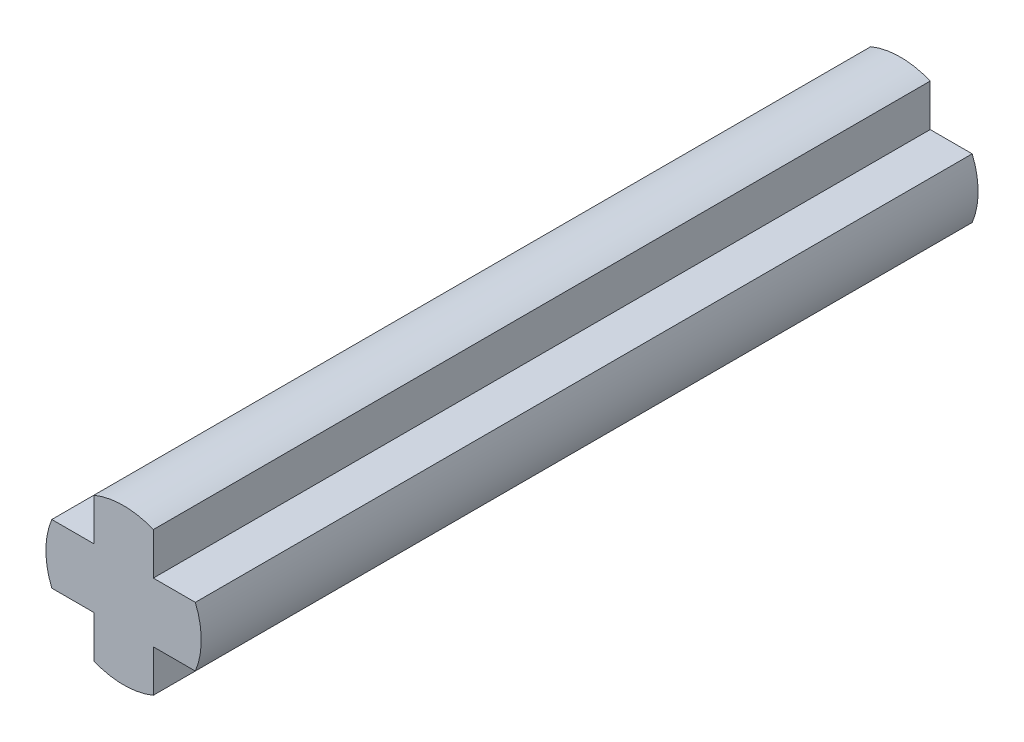
ISO-10303-21;
HEADER;
FILE_DESCRIPTION(('STEP AP214'),'2;1');
FILE_NAME('part.step','',(''),(''),'','','');
FILE_SCHEMA(('AUTOMOTIVE_DESIGN { 1 0 10303 214 1 1 1 1 }'));
ENDSEC;
DATA;
#1=APPLICATION_CONTEXT('core data for automotive mechanical design processes');
#2=APPLICATION_PROTOCOL_DEFINITION('international standard','automotive_design',2000,#1);
#3=PRODUCT_CONTEXT('',#1,'mechanical');
#4=PRODUCT('Part','Part','',(#3));
#5=PRODUCT_RELATED_PRODUCT_CATEGORY('part','',(#4));
#6=PRODUCT_DEFINITION_FORMATION('','',#4);
#7=PRODUCT_DEFINITION_CONTEXT('part definition',#1,'design');
#8=PRODUCT_DEFINITION('design','',#6,#7);
#9=PRODUCT_DEFINITION_SHAPE('','',#8);
#10=(LENGTH_UNIT() NAMED_UNIT(*) SI_UNIT(.MILLI.,.METRE.));
#11=(NAMED_UNIT(*) PLANE_ANGLE_UNIT() SI_UNIT($,.RADIAN.));
#12=(NAMED_UNIT(*) SI_UNIT($,.STERADIAN.) SOLID_ANGLE_UNIT());
#13=UNCERTAINTY_MEASURE_WITH_UNIT(LENGTH_MEASURE(1.E-05),#10,'distance_accuracy_value','');
#14=(GEOMETRIC_REPRESENTATION_CONTEXT(3) GLOBAL_UNCERTAINTY_ASSIGNED_CONTEXT((#13)) GLOBAL_UNIT_ASSIGNED_CONTEXT((#10,
#11,#12)) REPRESENTATION_CONTEXT('',''));
#15=CARTESIAN_POINT('',(0.,0.,0.));
#16=DIRECTION('',(0.,0.,1.));
#17=DIRECTION('',(1.,0.,0.));
#18=AXIS2_PLACEMENT_3D('',#15,#16,#17);
#19=CARTESIAN_POINT('',(-2.17082933460924,0.9,11.75));
#20=DIRECTION('',(0.,-1.,0.));
#21=DIRECTION('',(0.,0.,-1.));
#22=AXIS2_PLACEMENT_3D('',#19,#20,#21);
#23=PLANE('',#22);
#24=DIRECTION('',(-1.,0.,0.));
#25=VECTOR('',#24,1.);
#26=CARTESIAN_POINT('',(-2.17082933460924,0.9,-11.75));
#27=LINE('',#26,#25);
#28=CARTESIAN_POINT('',(-0.9,0.9,-11.75));
#29=VERTEX_POINT('',#28);
#30=CARTESIAN_POINT('',(-2.17082933460924,0.9,-11.75));
#31=VERTEX_POINT('',#30);
#32=EDGE_CURVE('E157',#29,#31,#27,.T.);
#33=ORIENTED_EDGE('',*,*,#32,.T.);
#34=DIRECTION('',(0.,0.,-1.));
#35=VECTOR('',#34,1.);
#36=CARTESIAN_POINT('',(-2.17082933460924,0.9,11.75));
#37=LINE('',#36,#35);
#38=CARTESIAN_POINT('',(-2.17082933460924,0.9,11.75));
#39=VERTEX_POINT('',#38);
#40=EDGE_CURVE('E11',#39,#31,#37,.T.);
#41=ORIENTED_EDGE('',*,*,#40,.F.);
#42=DIRECTION('',(-1.,0.,0.));
#43=VECTOR('',#42,1.);
#44=CARTESIAN_POINT('',(-2.17082933460924,0.9,11.75));
#45=LINE('',#44,#43);
#46=CARTESIAN_POINT('',(-0.9,0.9,11.75));
#47=VERTEX_POINT('',#46);
#48=EDGE_CURVE('E179',#47,#39,#45,.T.);
#49=ORIENTED_EDGE('',*,*,#48,.F.);
#50=DIRECTION('',(0.,0.,-1.));
#51=VECTOR('',#50,1.);
#52=CARTESIAN_POINT('',(-0.9,0.9,11.75));
#53=LINE('',#52,#51);
#54=EDGE_CURVE('E153',#47,#29,#53,.T.);
#55=ORIENTED_EDGE('',*,*,#54,.T.);
#56=EDGE_LOOP('',(#33,#41,#49,#55));
#57=FACE_BOUND('',#56,.T.);
#58=ADVANCED_FACE('F37',(#57),#23,.F.);
#59=CARTESIAN_POINT('',(0.,0.,11.75));
#60=DIRECTION('',(0.,0.,-1.));
#61=DIRECTION('',(-1.,0.,0.));
#62=AXIS2_PLACEMENT_3D('',#59,#60,#61);
#63=CYLINDRICAL_SURFACE('',#62,2.35);
#64=CARTESIAN_POINT('',(0.,0.,-11.75));
#65=DIRECTION('',(0.,0.,1.));
#66=DIRECTION('',(1.,0.,0.));
#67=AXIS2_PLACEMENT_3D('',#64,#65,#66);
#68=CIRCLE('',#67,2.35);
#69=CARTESIAN_POINT('',(-2.17082933460924,-0.9,-11.75));
#70=VERTEX_POINT('',#69);
#71=EDGE_CURVE('E160',#31,#70,#68,.T.);
#72=ORIENTED_EDGE('',*,*,#71,.T.);
#73=DIRECTION('',(0.,0.,-1.));
#74=VECTOR('',#73,1.);
#75=CARTESIAN_POINT('',(-2.17082933460924,-0.9,11.75));
#76=LINE('',#75,#74);
#77=CARTESIAN_POINT('',(-2.17082933460924,-0.9,11.75));
#78=VERTEX_POINT('',#77);
#79=EDGE_CURVE('E45',#78,#70,#76,.T.);
#80=ORIENTED_EDGE('',*,*,#79,.F.);
#81=CARTESIAN_POINT('',(0.,0.,11.75));
#82=DIRECTION('',(0.,0.,1.));
#83=DIRECTION('',(1.,0.,0.));
#84=AXIS2_PLACEMENT_3D('',#81,#82,#83);
#85=CIRCLE('',#84,2.35);
#86=EDGE_CURVE('E108',#39,#78,#85,.T.);
#87=ORIENTED_EDGE('',*,*,#86,.F.);
#88=ORIENTED_EDGE('',*,*,#40,.T.);
#89=EDGE_LOOP('',(#72,#80,#87,#88));
#90=FACE_BOUND('',#89,.T.);
#91=ADVANCED_FACE('F257',(#90),#63,.T.);
#92=CARTESIAN_POINT('',(-2.17082933460924,-0.9,11.75));
#93=DIRECTION('',(0.,1.,0.));
#94=DIRECTION('',(-1.,0.,0.));
#95=AXIS2_PLACEMENT_3D('',#92,#93,#94);
#96=PLANE('',#95);
#97=DIRECTION('',(1.,0.,0.));
#98=VECTOR('',#97,1.);
#99=CARTESIAN_POINT('',(-2.17082933460924,-0.9,-11.75));
#100=LINE('',#99,#98);
#101=CARTESIAN_POINT('',(-0.9,-0.9,-11.75));
#102=VERTEX_POINT('',#101);
#103=EDGE_CURVE('E162',#70,#102,#100,.T.);
#104=ORIENTED_EDGE('',*,*,#103,.T.);
#105=DIRECTION('',(0.,0.,-1.));
#106=VECTOR('',#105,1.);
#107=CARTESIAN_POINT('',(-0.9,-0.9,11.75));
#108=LINE('',#107,#106);
#109=CARTESIAN_POINT('',(-0.9,-0.9,11.75));
#110=VERTEX_POINT('',#109);
#111=EDGE_CURVE('E198',#110,#102,#108,.T.);
#112=ORIENTED_EDGE('',*,*,#111,.F.);
#113=DIRECTION('',(1.,0.,0.));
#114=VECTOR('',#113,1.);
#115=CARTESIAN_POINT('',(-2.17082933460924,-0.9,11.75));
#116=LINE('',#115,#114);
#117=EDGE_CURVE('E206',#78,#110,#116,.T.);
#118=ORIENTED_EDGE('',*,*,#117,.F.);
#119=ORIENTED_EDGE('',*,*,#79,.T.);
#120=EDGE_LOOP('',(#104,#112,#118,#119));
#121=FACE_BOUND('',#120,.T.);
#122=ADVANCED_FACE('F204',(#121),#96,.F.);
#123=CARTESIAN_POINT('',(-0.9,-0.9,11.75));
#124=DIRECTION('',(1.,0.,0.));
#125=DIRECTION('',(0.,1.,0.));
#126=AXIS2_PLACEMENT_3D('',#123,#124,#125);
#127=PLANE('',#126);
#128=DIRECTION('',(0.,-1.,0.));
#129=VECTOR('',#128,1.);
#130=CARTESIAN_POINT('',(-0.9,-0.9,-11.75));
#131=LINE('',#130,#129);
#132=CARTESIAN_POINT('',(-0.900000000000001,-2.17082933460924,-11.75));
#133=VERTEX_POINT('',#132);
#134=EDGE_CURVE('E164',#102,#133,#131,.T.);
#135=ORIENTED_EDGE('',*,*,#134,.T.);
#136=DIRECTION('',(0.,0.,-1.));
#137=VECTOR('',#136,1.);
#138=CARTESIAN_POINT('',(-0.900000000000001,-2.17082933460924,11.75));
#139=LINE('',#138,#137);
#140=CARTESIAN_POINT('',(-0.900000000000001,-2.17082933460924,11.75));
#141=VERTEX_POINT('',#140);
#142=EDGE_CURVE('E195',#141,#133,#139,.T.);
#143=ORIENTED_EDGE('',*,*,#142,.F.);
#144=DIRECTION('',(0.,-1.,0.));
#145=VECTOR('',#144,1.);
#146=CARTESIAN_POINT('',(-0.9,-0.9,11.75));
#147=LINE('',#146,#145);
#148=EDGE_CURVE('E224',#110,#141,#147,.T.);
#149=ORIENTED_EDGE('',*,*,#148,.F.);
#150=ORIENTED_EDGE('',*,*,#111,.T.);
#151=EDGE_LOOP('',(#135,#143,#149,#150));
#152=FACE_BOUND('',#151,.T.);
#153=ADVANCED_FACE('F215',(#152),#127,.F.);
#154=CARTESIAN_POINT('',(0.,0.,11.75));
#155=DIRECTION('',(0.,0.,-1.));
#156=DIRECTION('',(-1.,0.,0.));
#157=AXIS2_PLACEMENT_3D('',#154,#155,#156);
#158=CYLINDRICAL_SURFACE('',#157,2.35);
#159=CARTESIAN_POINT('',(0.,0.,-11.75));
#160=DIRECTION('',(0.,0.,1.));
#161=DIRECTION('',(1.,0.,0.));
#162=AXIS2_PLACEMENT_3D('',#159,#160,#161);
#163=CIRCLE('',#162,2.35);
#164=CARTESIAN_POINT('',(0.9,-2.17082933460924,-11.75));
#165=VERTEX_POINT('',#164);
#166=EDGE_CURVE('E166',#133,#165,#163,.T.);
#167=ORIENTED_EDGE('',*,*,#166,.T.);
#168=DIRECTION('',(0.,0.,-1.));
#169=VECTOR('',#168,1.);
#170=CARTESIAN_POINT('',(0.9,-2.17082933460924,11.75));
#171=LINE('',#170,#169);
#172=CARTESIAN_POINT('',(0.9,-2.17082933460924,11.75));
#173=VERTEX_POINT('',#172);
#174=EDGE_CURVE('E192',#173,#165,#171,.T.);
#175=ORIENTED_EDGE('',*,*,#174,.F.);
#176=CARTESIAN_POINT('',(0.,0.,11.75));
#177=DIRECTION('',(0.,0.,1.));
#178=DIRECTION('',(1.,0.,0.));
#179=AXIS2_PLACEMENT_3D('',#176,#177,#178);
#180=CIRCLE('',#179,2.35);
#181=EDGE_CURVE('E221',#141,#173,#180,.T.);
#182=ORIENTED_EDGE('',*,*,#181,.F.);
#183=ORIENTED_EDGE('',*,*,#142,.T.);
#184=EDGE_LOOP('',(#167,#175,#182,#183));
#185=FACE_BOUND('',#184,.T.);
#186=ADVANCED_FACE('F219',(#185),#158,.T.);
#187=CARTESIAN_POINT('',(0.9,-0.9,11.75));
#188=DIRECTION('',(-1.,0.,0.));
#189=DIRECTION('',(0.,-1.,0.));
#190=AXIS2_PLACEMENT_3D('',#187,#188,#189);
#191=PLANE('',#190);
#192=DIRECTION('',(0.,1.,0.));
#193=VECTOR('',#192,1.);
#194=CARTESIAN_POINT('',(0.9,-0.9,-11.75));
#195=LINE('',#194,#193);
#196=CARTESIAN_POINT('',(0.9,-0.9,-11.75));
#197=VERTEX_POINT('',#196);
#198=EDGE_CURVE('E168',#165,#197,#195,.T.);
#199=ORIENTED_EDGE('',*,*,#198,.T.);
#200=DIRECTION('',(0.,0.,-1.));
#201=VECTOR('',#200,1.);
#202=CARTESIAN_POINT('',(0.9,-0.9,11.75));
#203=LINE('',#202,#201);
#204=CARTESIAN_POINT('',(0.9,-0.9,11.75));
#205=VERTEX_POINT('',#204);
#206=EDGE_CURVE('E189',#205,#197,#203,.T.);
#207=ORIENTED_EDGE('',*,*,#206,.F.);
#208=DIRECTION('',(0.,1.,0.));
#209=VECTOR('',#208,1.);
#210=CARTESIAN_POINT('',(0.9,-0.9,11.75));
#211=LINE('',#210,#209);
#212=EDGE_CURVE('E223',#173,#205,#211,.T.);
#213=ORIENTED_EDGE('',*,*,#212,.F.);
#214=ORIENTED_EDGE('',*,*,#174,.T.);
#215=EDGE_LOOP('',(#199,#207,#213,#214));
#216=FACE_BOUND('',#215,.T.);
#217=ADVANCED_FACE('F270',(#216),#191,.F.);
#218=CARTESIAN_POINT('',(0.9,-0.9,11.75));
#219=DIRECTION('',(0.,1.,0.));
#220=DIRECTION('',(-1.,0.,0.));
#221=AXIS2_PLACEMENT_3D('',#218,#219,#220);
#222=PLANE('',#221);
#223=DIRECTION('',(1.,0.,0.));
#224=VECTOR('',#223,1.);
#225=CARTESIAN_POINT('',(0.9,-0.9,-11.75));
#226=LINE('',#225,#224);
#227=CARTESIAN_POINT('',(2.17082933460924,-0.900000000000001,-11.75));
#228=VERTEX_POINT('',#227);
#229=EDGE_CURVE('E170',#197,#228,#226,.T.);
#230=ORIENTED_EDGE('',*,*,#229,.T.);
#231=DIRECTION('',(0.,0.,-1.));
#232=VECTOR('',#231,1.);
#233=CARTESIAN_POINT('',(2.17082933460924,-0.900000000000001,11.75));
#234=LINE('',#233,#232);
#235=CARTESIAN_POINT('',(2.17082933460924,-0.900000000000001,11.75));
#236=VERTEX_POINT('',#235);
#237=EDGE_CURVE('E186',#236,#228,#234,.T.);
#238=ORIENTED_EDGE('',*,*,#237,.F.);
#239=DIRECTION('',(1.,0.,0.));
#240=VECTOR('',#239,1.);
#241=CARTESIAN_POINT('',(0.9,-0.9,11.75));
#242=LINE('',#241,#240);
#243=EDGE_CURVE('E226',#205,#236,#242,.T.);
#244=ORIENTED_EDGE('',*,*,#243,.F.);
#245=ORIENTED_EDGE('',*,*,#206,.T.);
#246=EDGE_LOOP('',(#230,#238,#244,#245));
#247=FACE_BOUND('',#246,.T.);
#248=ADVANCED_FACE('F273',(#247),#222,.F.);
#249=CARTESIAN_POINT('',(0.,0.,11.75));
#250=DIRECTION('',(0.,0.,-1.));
#251=DIRECTION('',(-1.,0.,0.));
#252=AXIS2_PLACEMENT_3D('',#249,#250,#251);
#253=CYLINDRICAL_SURFACE('',#252,2.35);
#254=CARTESIAN_POINT('',(0.,0.,-11.75));
#255=DIRECTION('',(0.,0.,1.));
#256=DIRECTION('',(1.,0.,0.));
#257=AXIS2_PLACEMENT_3D('',#254,#255,#256);
#258=CIRCLE('',#257,2.35);
#259=CARTESIAN_POINT('',(2.17082933460924,0.9,-11.75));
#260=VERTEX_POINT('',#259);
#261=EDGE_CURVE('E172',#228,#260,#258,.T.);
#262=ORIENTED_EDGE('',*,*,#261,.T.);
#263=DIRECTION('',(0.,0.,-1.));
#264=VECTOR('',#263,1.);
#265=CARTESIAN_POINT('',(2.17082933460924,0.9,11.75));
#266=LINE('',#265,#264);
#267=CARTESIAN_POINT('',(2.17082933460924,0.9,11.75));
#268=VERTEX_POINT('',#267);
#269=EDGE_CURVE('E183',#268,#260,#266,.T.);
#270=ORIENTED_EDGE('',*,*,#269,.F.);
#271=CARTESIAN_POINT('',(0.,0.,11.75));
#272=DIRECTION('',(0.,0.,1.));
#273=DIRECTION('',(1.,0.,0.));
#274=AXIS2_PLACEMENT_3D('',#271,#272,#273);
#275=CIRCLE('',#274,2.35);
#276=EDGE_CURVE('E232',#236,#268,#275,.T.);
#277=ORIENTED_EDGE('',*,*,#276,.F.);
#278=ORIENTED_EDGE('',*,*,#237,.T.);
#279=EDGE_LOOP('',(#262,#270,#277,#278));
#280=FACE_BOUND('',#279,.T.);
#281=ADVANCED_FACE('F238',(#280),#253,.T.);
#282=CARTESIAN_POINT('',(0.9,0.9,11.75));
#283=DIRECTION('',(0.,-1.,0.));
#284=DIRECTION('',(0.,0.,-1.));
#285=AXIS2_PLACEMENT_3D('',#282,#283,#284);
#286=PLANE('',#285);
#287=DIRECTION('',(-1.,0.,0.));
#288=VECTOR('',#287,1.);
#289=CARTESIAN_POINT('',(0.9,0.9,-11.75));
#290=LINE('',#289,#288);
#291=CARTESIAN_POINT('',(0.9,0.9,-11.75));
#292=VERTEX_POINT('',#291);
#293=EDGE_CURVE('E174',#260,#292,#290,.T.);
#294=ORIENTED_EDGE('',*,*,#293,.T.);
#295=DIRECTION('',(0.,0.,-1.));
#296=VECTOR('',#295,1.);
#297=CARTESIAN_POINT('',(0.9,0.9,11.75));
#298=LINE('',#297,#296);
#299=CARTESIAN_POINT('',(0.9,0.9,11.75));
#300=VERTEX_POINT('',#299);
#301=EDGE_CURVE('E148',#300,#292,#298,.T.);
#302=ORIENTED_EDGE('',*,*,#301,.F.);
#303=DIRECTION('',(-1.,0.,0.));
#304=VECTOR('',#303,1.);
#305=CARTESIAN_POINT('',(0.9,0.9,11.75));
#306=LINE('',#305,#304);
#307=EDGE_CURVE('E139',#268,#300,#306,.T.);
#308=ORIENTED_EDGE('',*,*,#307,.F.);
#309=ORIENTED_EDGE('',*,*,#269,.T.);
#310=EDGE_LOOP('',(#294,#302,#308,#309));
#311=FACE_BOUND('',#310,.T.);
#312=ADVANCED_FACE('F242',(#311),#286,.F.);
#313=CARTESIAN_POINT('',(0.9,2.17082933460924,11.75));
#314=DIRECTION('',(-1.,0.,0.));
#315=DIRECTION('',(0.,-1.,0.));
#316=AXIS2_PLACEMENT_3D('',#313,#314,#315);
#317=PLANE('',#316);
#318=DIRECTION('',(0.,1.,0.));
#319=VECTOR('',#318,1.);
#320=CARTESIAN_POINT('',(0.9,2.17082933460924,-11.75));
#321=LINE('',#320,#319);
#322=CARTESIAN_POINT('',(0.9,2.17082933460924,-11.75));
#323=VERTEX_POINT('',#322);
#324=EDGE_CURVE('E147',#292,#323,#321,.T.);
#325=ORIENTED_EDGE('',*,*,#324,.T.);
#326=DIRECTION('',(0.,0.,-1.));
#327=VECTOR('',#326,1.);
#328=CARTESIAN_POINT('',(0.9,2.17082933460924,11.75));
#329=LINE('',#328,#327);
#330=CARTESIAN_POINT('',(0.9,2.17082933460924,11.75));
#331=VERTEX_POINT('',#330);
#332=EDGE_CURVE('E144',#331,#323,#329,.T.);
#333=ORIENTED_EDGE('',*,*,#332,.F.);
#334=DIRECTION('',(0.,1.,0.));
#335=VECTOR('',#334,1.);
#336=CARTESIAN_POINT('',(0.9,2.17082933460924,11.75));
#337=LINE('',#336,#335);
#338=EDGE_CURVE('E133',#300,#331,#337,.T.);
#339=ORIENTED_EDGE('',*,*,#338,.F.);
#340=ORIENTED_EDGE('',*,*,#301,.T.);
#341=EDGE_LOOP('',(#325,#333,#339,#340));
#342=FACE_BOUND('',#341,.T.);
#343=ADVANCED_FACE('F145',(#342),#317,.F.);
#344=CARTESIAN_POINT('',(0.,0.,11.75));
#345=DIRECTION('',(0.,0.,-1.));
#346=DIRECTION('',(-1.,0.,0.));
#347=AXIS2_PLACEMENT_3D('',#344,#345,#346);
#348=CYLINDRICAL_SURFACE('',#347,2.35);
#349=CARTESIAN_POINT('',(0.,0.,-11.75));
#350=DIRECTION('',(0.,0.,1.));
#351=DIRECTION('',(1.,0.,0.));
#352=AXIS2_PLACEMENT_3D('',#349,#350,#351);
#353=CIRCLE('',#352,2.35);
#354=CARTESIAN_POINT('',(-0.9,2.17082933460924,-11.75));
#355=VERTEX_POINT('',#354);
#356=EDGE_CURVE('E94',#323,#355,#353,.T.);
#357=ORIENTED_EDGE('',*,*,#356,.T.);
#358=DIRECTION('',(0.,0.,-1.));
#359=VECTOR('',#358,1.);
#360=CARTESIAN_POINT('',(-0.9,2.17082933460924,11.75));
#361=LINE('',#360,#359);
#362=CARTESIAN_POINT('',(-0.9,2.17082933460924,11.75));
#363=VERTEX_POINT('',#362);
#364=EDGE_CURVE('E149',#363,#355,#361,.T.);
#365=ORIENTED_EDGE('',*,*,#364,.F.);
#366=CARTESIAN_POINT('',(0.,0.,11.75));
#367=DIRECTION('',(0.,0.,1.));
#368=DIRECTION('',(1.,0.,0.));
#369=AXIS2_PLACEMENT_3D('',#366,#367,#368);
#370=CIRCLE('',#369,2.35);
#371=EDGE_CURVE('E137',#331,#363,#370,.T.);
#372=ORIENTED_EDGE('',*,*,#371,.F.);
#373=ORIENTED_EDGE('',*,*,#332,.T.);
#374=EDGE_LOOP('',(#357,#365,#372,#373));
#375=FACE_BOUND('',#374,.T.);
#376=ADVANCED_FACE('F151',(#375),#348,.T.);
#377=CARTESIAN_POINT('',(-0.9,2.17082933460924,11.75));
#378=DIRECTION('',(1.,0.,0.));
#379=DIRECTION('',(0.,1.,0.));
#380=AXIS2_PLACEMENT_3D('',#377,#378,#379);
#381=PLANE('',#380);
#382=DIRECTION('',(0.,-1.,0.));
#383=VECTOR('',#382,1.);
#384=CARTESIAN_POINT('',(-0.9,2.17082933460924,-11.75));
#385=LINE('',#384,#383);
#386=EDGE_CURVE('E100',#355,#29,#385,.T.);
#387=ORIENTED_EDGE('',*,*,#386,.T.);
#388=ORIENTED_EDGE('',*,*,#54,.F.);
#389=DIRECTION('',(0.,-1.,0.));
#390=VECTOR('',#389,1.);
#391=CARTESIAN_POINT('',(-0.9,2.17082933460924,11.75));
#392=LINE('',#391,#390);
#393=EDGE_CURVE('E53',#363,#47,#392,.T.);
#394=ORIENTED_EDGE('',*,*,#393,.F.);
#395=ORIENTED_EDGE('',*,*,#364,.T.);
#396=EDGE_LOOP('',(#387,#388,#394,#395));
#397=FACE_BOUND('',#396,.T.);
#398=ADVANCED_FACE('F246',(#397),#381,.F.);
#399=CARTESIAN_POINT('',(0.,0.,11.75));
#400=DIRECTION('',(0.,0.,1.));
#401=DIRECTION('',(1.,0.,0.));
#402=AXIS2_PLACEMENT_3D('',#399,#400,#401);
#403=PLANE('',#402);
#404=ORIENTED_EDGE('',*,*,#48,.T.);
#405=ORIENTED_EDGE('',*,*,#86,.T.);
#406=ORIENTED_EDGE('',*,*,#117,.T.);
#407=ORIENTED_EDGE('',*,*,#148,.T.);
#408=ORIENTED_EDGE('',*,*,#181,.T.);
#409=ORIENTED_EDGE('',*,*,#212,.T.);
#410=ORIENTED_EDGE('',*,*,#243,.T.);
#411=ORIENTED_EDGE('',*,*,#276,.T.);
#412=ORIENTED_EDGE('',*,*,#307,.T.);
#413=ORIENTED_EDGE('',*,*,#338,.T.);
#414=ORIENTED_EDGE('',*,*,#371,.T.);
#415=ORIENTED_EDGE('',*,*,#393,.T.);
#416=EDGE_LOOP('',(#404,#405,#406,#407,#408,#409,#410,#411,#412,#413,#414,#415));
#417=FACE_BOUND('',#416,.T.);
#418=ADVANCED_FACE('F135',(#417),#403,.T.);
#419=CARTESIAN_POINT('',(0.,0.,-11.75));
#420=DIRECTION('',(0.,0.,1.));
#421=DIRECTION('',(1.,0.,0.));
#422=AXIS2_PLACEMENT_3D('',#419,#420,#421);
#423=PLANE('',#422);
#424=ORIENTED_EDGE('',*,*,#32,.F.);
#425=ORIENTED_EDGE('',*,*,#386,.F.);
#426=ORIENTED_EDGE('',*,*,#356,.F.);
#427=ORIENTED_EDGE('',*,*,#324,.F.);
#428=ORIENTED_EDGE('',*,*,#293,.F.);
#429=ORIENTED_EDGE('',*,*,#261,.F.);
#430=ORIENTED_EDGE('',*,*,#229,.F.);
#431=ORIENTED_EDGE('',*,*,#198,.F.);
#432=ORIENTED_EDGE('',*,*,#166,.F.);
#433=ORIENTED_EDGE('',*,*,#134,.F.);
#434=ORIENTED_EDGE('',*,*,#103,.F.);
#435=ORIENTED_EDGE('',*,*,#71,.F.);
#436=EDGE_LOOP('',(#424,#425,#426,#427,#428,#429,#430,#431,#432,#433,#434,#435));
#437=FACE_BOUND('',#436,.T.);
#438=ADVANCED_FACE('F210',(#437),#423,.F.);
#439=CLOSED_SHELL('',(#58,#91,#122,#153,#186,#217,#248,#281,#312,#343,#376,#398,#418,#438));
#440=MANIFOLD_SOLID_BREP('B2',#439);
#441=ADVANCED_BREP_SHAPE_REPRESENTATION('',(#18,#440),#14);
#442=SHAPE_DEFINITION_REPRESENTATION(#9,#441);
ENDSEC;
END-ISO-10303-21;
